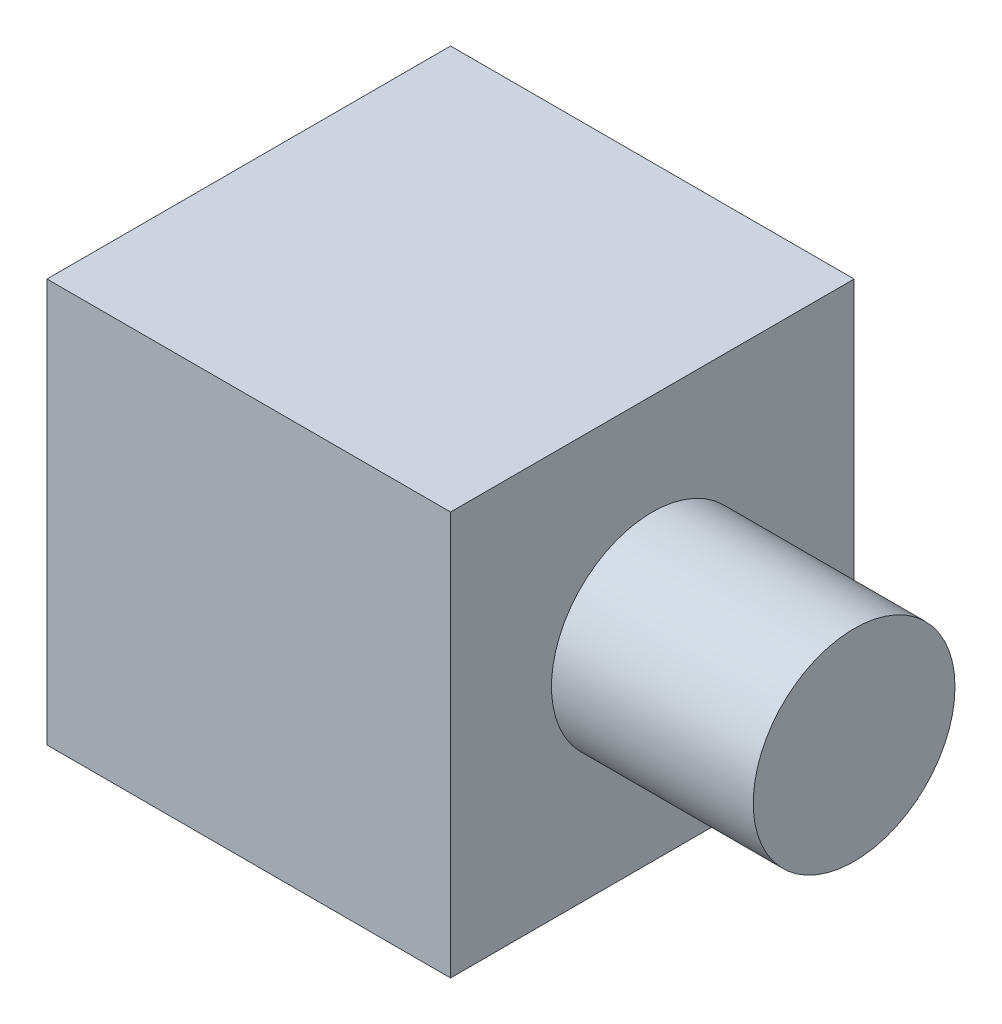
ISO-10303-21;
HEADER;
FILE_DESCRIPTION(('STEP AP214'),'2;1');
FILE_NAME('part.step','',(''),(''),'','','');
FILE_SCHEMA(('AUTOMOTIVE_DESIGN { 1 0 10303 214 1 1 1 1 }'));
ENDSEC;
DATA;
#1=APPLICATION_CONTEXT('core data for automotive mechanical design processes');
#2=APPLICATION_PROTOCOL_DEFINITION('international standard','automotive_design',2000,#1);
#3=PRODUCT_CONTEXT('',#1,'mechanical');
#4=PRODUCT('Part','Part','',(#3));
#5=PRODUCT_RELATED_PRODUCT_CATEGORY('part','',(#4));
#6=PRODUCT_DEFINITION_FORMATION('','',#4);
#7=PRODUCT_DEFINITION_CONTEXT('part definition',#1,'design');
#8=PRODUCT_DEFINITION('design','',#6,#7);
#9=PRODUCT_DEFINITION_SHAPE('','',#8);
#10=(LENGTH_UNIT() NAMED_UNIT(*) SI_UNIT(.MILLI.,.METRE.));
#11=(NAMED_UNIT(*) PLANE_ANGLE_UNIT() SI_UNIT($,.RADIAN.));
#12=(NAMED_UNIT(*) SI_UNIT($,.STERADIAN.) SOLID_ANGLE_UNIT());
#13=UNCERTAINTY_MEASURE_WITH_UNIT(LENGTH_MEASURE(1.E-05),#10,'distance_accuracy_value','');
#14=(GEOMETRIC_REPRESENTATION_CONTEXT(3) GLOBAL_UNCERTAINTY_ASSIGNED_CONTEXT((#13)) GLOBAL_UNIT_ASSIGNED_CONTEXT((#10,
#11,#12)) REPRESENTATION_CONTEXT('',''));
#15=CARTESIAN_POINT('',(0.,0.,0.));
#16=DIRECTION('',(0.,0.,1.));
#17=DIRECTION('',(1.,0.,0.));
#18=AXIS2_PLACEMENT_3D('',#15,#16,#17);
#19=CARTESIAN_POINT('',(10.,-10.,10.));
#20=DIRECTION('',(-1.,0.,0.));
#21=DIRECTION('',(0.,0.,1.));
#22=AXIS2_PLACEMENT_3D('',#19,#20,#21);
#23=PLANE('',#22);
#24=CARTESIAN_POINT('',(10.,0.,0.));
#25=DIRECTION('',(1.,0.,0.));
#26=DIRECTION('',(0.,0.,-1.));
#27=AXIS2_PLACEMENT_3D('',#24,#25,#26);
#28=CIRCLE('',#27,5.);
#29=CARTESIAN_POINT('',(10.,0.,-5.));
#30=VERTEX_POINT('',#29);
#31=EDGE_CURVE('E11',#30,#30,#28,.T.);
#32=ORIENTED_EDGE('',*,*,#31,.F.);
#33=EDGE_LOOP('',(#32));
#34=FACE_BOUND('',#33,.T.);
#35=DIRECTION('',(0.,1.,0.));
#36=VECTOR('',#35,1.);
#37=CARTESIAN_POINT('',(10.,-10.,-10.));
#38=LINE('',#37,#36);
#39=CARTESIAN_POINT('',(10.,-10.,-10.));
#40=VERTEX_POINT('',#39);
#41=CARTESIAN_POINT('',(10.,10.,-10.));
#42=VERTEX_POINT('',#41);
#43=EDGE_CURVE('E108',#40,#42,#38,.T.);
#44=ORIENTED_EDGE('',*,*,#43,.T.);
#45=DIRECTION('',(0.,0.,-1.));
#46=VECTOR('',#45,1.);
#47=CARTESIAN_POINT('',(10.,10.,10.));
#48=LINE('',#47,#46);
#49=CARTESIAN_POINT('',(10.,10.,10.));
#50=VERTEX_POINT('',#49);
#51=EDGE_CURVE('E45',#50,#42,#48,.T.);
#52=ORIENTED_EDGE('',*,*,#51,.F.);
#53=DIRECTION('',(0.,1.,0.));
#54=VECTOR('',#53,1.);
#55=CARTESIAN_POINT('',(10.,-10.,10.));
#56=LINE('',#55,#54);
#57=CARTESIAN_POINT('',(10.,-10.,10.));
#58=VERTEX_POINT('',#57);
#59=EDGE_CURVE('E95',#58,#50,#56,.T.);
#60=ORIENTED_EDGE('',*,*,#59,.F.);
#61=DIRECTION('',(0.,0.,-1.));
#62=VECTOR('',#61,1.);
#63=CARTESIAN_POINT('',(10.,-10.,10.));
#64=LINE('',#63,#62);
#65=EDGE_CURVE('E104',#58,#40,#64,.T.);
#66=ORIENTED_EDGE('',*,*,#65,.T.);
#67=EDGE_LOOP('',(#44,#52,#60,#66));
#68=FACE_BOUND('',#67,.T.);
#69=ADVANCED_FACE('F42',(#34,#68),#23,.F.);
#70=CARTESIAN_POINT('',(-10.,10.,10.));
#71=DIRECTION('',(0.,-1.,0.));
#72=DIRECTION('',(0.,0.,-1.));
#73=AXIS2_PLACEMENT_3D('',#70,#71,#72);
#74=PLANE('',#73);
#75=DIRECTION('',(-1.,0.,0.));
#76=VECTOR('',#75,1.);
#77=CARTESIAN_POINT('',(-10.,10.,-10.));
#78=LINE('',#77,#76);
#79=CARTESIAN_POINT('',(-10.,10.,-10.));
#80=VERTEX_POINT('',#79);
#81=EDGE_CURVE('E100',#42,#80,#78,.T.);
#82=ORIENTED_EDGE('',*,*,#81,.T.);
#83=DIRECTION('',(0.,0.,-1.));
#84=VECTOR('',#83,1.);
#85=CARTESIAN_POINT('',(-10.,10.,10.));
#86=LINE('',#85,#84);
#87=CARTESIAN_POINT('',(-10.,10.,10.));
#88=VERTEX_POINT('',#87);
#89=EDGE_CURVE('E98',#88,#80,#86,.T.);
#90=ORIENTED_EDGE('',*,*,#89,.F.);
#91=DIRECTION('',(-1.,0.,0.));
#92=VECTOR('',#91,1.);
#93=CARTESIAN_POINT('',(-10.,10.,10.));
#94=LINE('',#93,#92);
#95=EDGE_CURVE('E90',#50,#88,#94,.T.);
#96=ORIENTED_EDGE('',*,*,#95,.F.);
#97=ORIENTED_EDGE('',*,*,#51,.T.);
#98=EDGE_LOOP('',(#82,#90,#96,#97));
#99=FACE_BOUND('',#98,.T.);
#100=ADVANCED_FACE('F99',(#99),#74,.F.);
#101=CARTESIAN_POINT('',(-10.,-10.,10.));
#102=DIRECTION('',(1.,0.,0.));
#103=DIRECTION('',(0.,0.,-1.));
#104=AXIS2_PLACEMENT_3D('',#101,#102,#103);
#105=PLANE('',#104);
#106=DIRECTION('',(0.,-1.,0.));
#107=VECTOR('',#106,1.);
#108=CARTESIAN_POINT('',(-10.,-10.,-10.));
#109=LINE('',#108,#107);
#110=CARTESIAN_POINT('',(-10.,-10.,-10.));
#111=VERTEX_POINT('',#110);
#112=EDGE_CURVE('E76',#80,#111,#109,.T.);
#113=ORIENTED_EDGE('',*,*,#112,.T.);
#114=DIRECTION('',(0.,0.,-1.));
#115=VECTOR('',#114,1.);
#116=CARTESIAN_POINT('',(-10.,-10.,10.));
#117=LINE('',#116,#115);
#118=CARTESIAN_POINT('',(-10.,-10.,10.));
#119=VERTEX_POINT('',#118);
#120=EDGE_CURVE('E101',#119,#111,#117,.T.);
#121=ORIENTED_EDGE('',*,*,#120,.F.);
#122=DIRECTION('',(0.,-1.,0.));
#123=VECTOR('',#122,1.);
#124=CARTESIAN_POINT('',(-10.,-10.,10.));
#125=LINE('',#124,#123);
#126=EDGE_CURVE('E93',#88,#119,#125,.T.);
#127=ORIENTED_EDGE('',*,*,#126,.F.);
#128=ORIENTED_EDGE('',*,*,#89,.T.);
#129=EDGE_LOOP('',(#113,#121,#127,#128));
#130=FACE_BOUND('',#129,.T.);
#131=ADVANCED_FACE('F102',(#130),#105,.F.);
#132=CARTESIAN_POINT('',(-10.,-10.,10.));
#133=DIRECTION('',(0.,1.,0.));
#134=DIRECTION('',(0.,0.,1.));
#135=AXIS2_PLACEMENT_3D('',#132,#133,#134);
#136=PLANE('',#135);
#137=DIRECTION('',(1.,0.,0.));
#138=VECTOR('',#137,1.);
#139=CARTESIAN_POINT('',(-10.,-10.,-10.));
#140=LINE('',#139,#138);
#141=EDGE_CURVE('E82',#111,#40,#140,.T.);
#142=ORIENTED_EDGE('',*,*,#141,.T.);
#143=ORIENTED_EDGE('',*,*,#65,.F.);
#144=DIRECTION('',(1.,0.,0.));
#145=VECTOR('',#144,1.);
#146=CARTESIAN_POINT('',(-10.,-10.,10.));
#147=LINE('',#146,#145);
#148=EDGE_CURVE('E59',#119,#58,#147,.T.);
#149=ORIENTED_EDGE('',*,*,#148,.F.);
#150=ORIENTED_EDGE('',*,*,#120,.T.);
#151=EDGE_LOOP('',(#142,#143,#149,#150));
#152=FACE_BOUND('',#151,.T.);
#153=ADVANCED_FACE('F116',(#152),#136,.F.);
#154=CARTESIAN_POINT('',(0.,0.,10.));
#155=DIRECTION('',(0.,0.,-1.));
#156=DIRECTION('',(-1.,0.,0.));
#157=AXIS2_PLACEMENT_3D('',#154,#155,#156);
#158=PLANE('',#157);
#159=ORIENTED_EDGE('',*,*,#59,.T.);
#160=ORIENTED_EDGE('',*,*,#95,.T.);
#161=ORIENTED_EDGE('',*,*,#126,.T.);
#162=ORIENTED_EDGE('',*,*,#148,.T.);
#163=EDGE_LOOP('',(#159,#160,#161,#162));
#164=FACE_BOUND('',#163,.T.);
#165=ADVANCED_FACE('F91',(#164),#158,.F.);
#166=CARTESIAN_POINT('',(0.,0.,-10.));
#167=DIRECTION('',(0.,0.,-1.));
#168=DIRECTION('',(-1.,0.,0.));
#169=AXIS2_PLACEMENT_3D('',#166,#167,#168);
#170=PLANE('',#169);
#171=ORIENTED_EDGE('',*,*,#43,.F.);
#172=ORIENTED_EDGE('',*,*,#141,.F.);
#173=ORIENTED_EDGE('',*,*,#112,.F.);
#174=ORIENTED_EDGE('',*,*,#81,.F.);
#175=EDGE_LOOP('',(#171,#172,#173,#174));
#176=FACE_BOUND('',#175,.T.);
#177=ADVANCED_FACE('F119',(#176),#170,.T.);
#178=CARTESIAN_POINT('',(20.,0.,0.));
#179=DIRECTION('',(-1.,0.,0.));
#180=DIRECTION('',(0.,0.,1.));
#181=AXIS2_PLACEMENT_3D('',#178,#179,#180);
#182=CYLINDRICAL_SURFACE('',#181,5.);
#183=CARTESIAN_POINT('',(20.,0.,0.));
#184=DIRECTION('',(1.,0.,0.));
#185=DIRECTION('',(0.,0.,-1.));
#186=AXIS2_PLACEMENT_3D('',#183,#184,#185);
#187=CIRCLE('',#186,5.);
#188=CARTESIAN_POINT('',(20.,0.,-5.));
#189=VERTEX_POINT('',#188);
#190=EDGE_CURVE('E111',#189,#189,#187,.T.);
#191=ORIENTED_EDGE('',*,*,#190,.F.);
#192=EDGE_LOOP('',(#191));
#193=FACE_BOUND('',#192,.T.);
#194=ORIENTED_EDGE('',*,*,#31,.T.);
#195=EDGE_LOOP('',(#194));
#196=FACE_BOUND('',#195,.T.);
#197=ADVANCED_FACE('F127',(#193,#196),#182,.T.);
#198=CARTESIAN_POINT('',(20.,0.,0.));
#199=DIRECTION('',(1.,0.,0.));
#200=DIRECTION('',(0.,0.,-1.));
#201=AXIS2_PLACEMENT_3D('',#198,#199,#200);
#202=PLANE('',#201);
#203=ORIENTED_EDGE('',*,*,#190,.T.);
#204=EDGE_LOOP('',(#203));
#205=FACE_BOUND('',#204,.T.);
#206=ADVANCED_FACE('F125',(#205),#202,.T.);
#207=CLOSED_SHELL('',(#69,#100,#131,#153,#165,#177,#197,#206));
#208=MANIFOLD_SOLID_BREP('B2',#207);
#209=ADVANCED_BREP_SHAPE_REPRESENTATION('',(#18,#208),#14);
#210=SHAPE_DEFINITION_REPRESENTATION(#9,#209);
ENDSEC;
END-ISO-10303-21;
